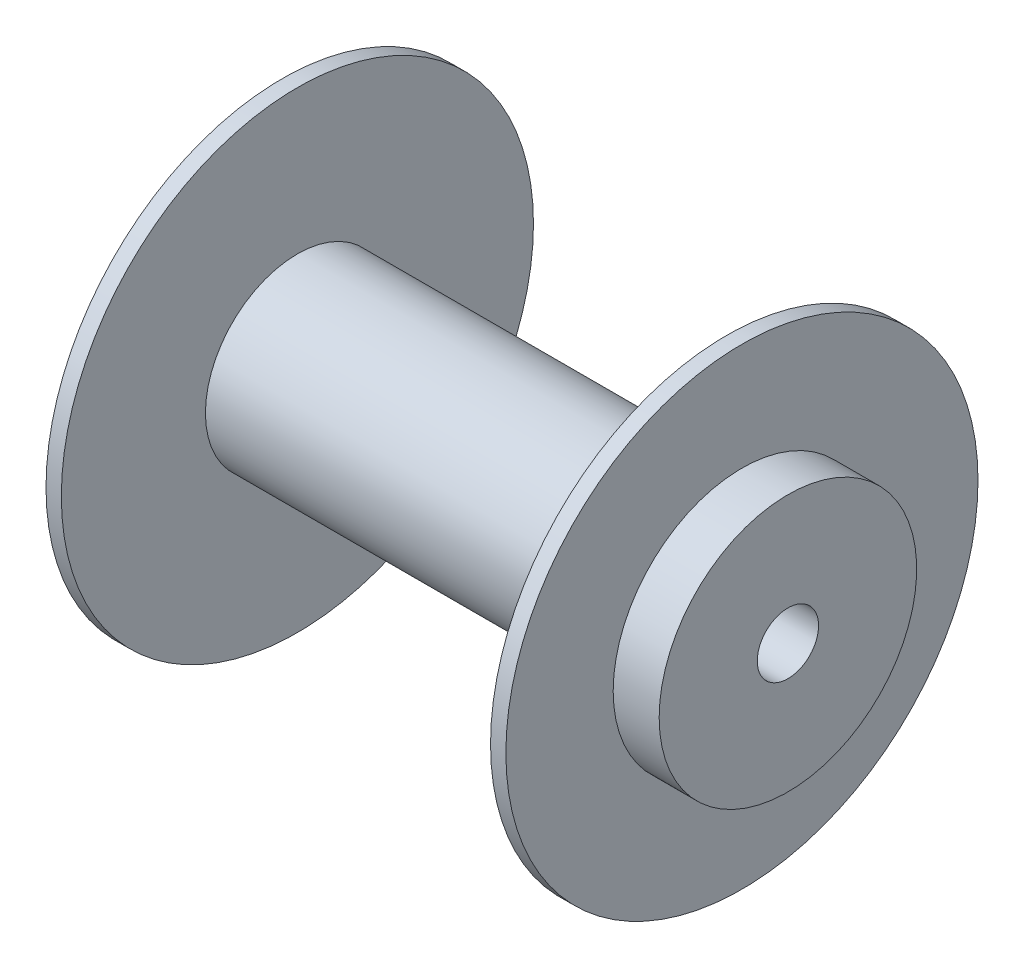
ISO-10303-21;
HEADER;
FILE_DESCRIPTION(('STEP AP214'),'2;1');
FILE_NAME('part.step','',(''),(''),'','','');
FILE_SCHEMA(('AUTOMOTIVE_DESIGN { 1 0 10303 214 1 1 1 1 }'));
ENDSEC;
DATA;
#1=APPLICATION_CONTEXT('core data for automotive mechanical design processes');
#2=APPLICATION_PROTOCOL_DEFINITION('international standard','automotive_design',2000,#1);
#3=PRODUCT_CONTEXT('',#1,'mechanical');
#4=PRODUCT('Part','Part','',(#3));
#5=PRODUCT_RELATED_PRODUCT_CATEGORY('part','',(#4));
#6=PRODUCT_DEFINITION_FORMATION('','',#4);
#7=PRODUCT_DEFINITION_CONTEXT('part definition',#1,'design');
#8=PRODUCT_DEFINITION('design','',#6,#7);
#9=PRODUCT_DEFINITION_SHAPE('','',#8);
#10=(LENGTH_UNIT() NAMED_UNIT(*) SI_UNIT(.MILLI.,.METRE.));
#11=(NAMED_UNIT(*) PLANE_ANGLE_UNIT() SI_UNIT($,.RADIAN.));
#12=(NAMED_UNIT(*) SI_UNIT($,.STERADIAN.) SOLID_ANGLE_UNIT());
#13=UNCERTAINTY_MEASURE_WITH_UNIT(LENGTH_MEASURE(1.E-05),#10,'distance_accuracy_value','');
#14=(GEOMETRIC_REPRESENTATION_CONTEXT(3) GLOBAL_UNCERTAINTY_ASSIGNED_CONTEXT((#13)) GLOBAL_UNIT_ASSIGNED_CONTEXT((#10,
#11,#12)) REPRESENTATION_CONTEXT('',''));
#15=CARTESIAN_POINT('',(0.,0.,0.));
#16=DIRECTION('',(0.,0.,1.));
#17=DIRECTION('',(1.,0.,0.));
#18=AXIS2_PLACEMENT_3D('',#15,#16,#17);
#19=CARTESIAN_POINT('',(160.,0.,0.));
#20=DIRECTION('',(-1.,0.,0.));
#21=DIRECTION('',(0.,0.,1.));
#22=AXIS2_PLACEMENT_3D('',#19,#20,#21);
#23=PLANE('',#22);
#24=CARTESIAN_POINT('',(160.,-30.,0.));
#25=DIRECTION('',(-1.,0.,0.));
#26=DIRECTION('',(0.,0.,1.));
#27=AXIS2_PLACEMENT_3D('',#24,#25,#26);
#28=CIRCLE('',#27,77.);
#29=CARTESIAN_POINT('',(160.,-30.,77.));
#30=VERTEX_POINT('',#29);
#31=EDGE_CURVE('E79',#30,#30,#28,.T.);
#32=ORIENTED_EDGE('',*,*,#31,.T.);
#33=EDGE_LOOP('',(#32));
#34=FACE_BOUND('',#33,.T.);
#35=CARTESIAN_POINT('',(160.,-30.,0.));
#36=DIRECTION('',(-1.,0.,0.));
#37=DIRECTION('',(0.,0.,1.));
#38=AXIS2_PLACEMENT_3D('',#35,#36,#37);
#39=CIRCLE('',#38,30.);
#40=CARTESIAN_POINT('',(160.,-30.,30.));
#41=VERTEX_POINT('',#40);
#42=EDGE_CURVE('E10',#41,#41,#39,.T.);
#43=ORIENTED_EDGE('',*,*,#42,.F.);
#44=EDGE_LOOP('',(#43));
#45=FACE_BOUND('',#44,.T.);
#46=ADVANCED_FACE('F39',(#34,#45),#23,.T.);
#47=CARTESIAN_POINT('',(0.,-30.,0.));
#48=DIRECTION('',(-1.,0.,0.));
#49=DIRECTION('',(0.,0.,1.));
#50=AXIS2_PLACEMENT_3D('',#47,#48,#49);
#51=CYLINDRICAL_SURFACE('',#50,30.);
#52=CARTESIAN_POINT('',(20.,-30.,0.));
#53=DIRECTION('',(-1.,0.,0.));
#54=DIRECTION('',(0.,0.,1.));
#55=AXIS2_PLACEMENT_3D('',#52,#53,#54);
#56=CIRCLE('',#55,30.);
#57=CARTESIAN_POINT('',(20.,-30.,30.));
#58=VERTEX_POINT('',#57);
#59=EDGE_CURVE('E45',#58,#58,#56,.T.);
#60=ORIENTED_EDGE('',*,*,#59,.F.);
#61=EDGE_LOOP('',(#60));
#62=FACE_BOUND('',#61,.T.);
#63=ORIENTED_EDGE('',*,*,#42,.T.);
#64=EDGE_LOOP('',(#63));
#65=FACE_BOUND('',#64,.T.);
#66=ADVANCED_FACE('F97',(#62,#65),#51,.T.);
#67=CARTESIAN_POINT('',(20.,0.,0.));
#68=DIRECTION('',(1.,0.,0.));
#69=DIRECTION('',(0.,0.,-1.));
#70=AXIS2_PLACEMENT_3D('',#67,#68,#69);
#71=PLANE('',#70);
#72=ORIENTED_EDGE('',*,*,#59,.T.);
#73=EDGE_LOOP('',(#72));
#74=FACE_BOUND('',#73,.T.);
#75=CARTESIAN_POINT('',(20.,-30.,0.));
#76=DIRECTION('',(-1.,0.,0.));
#77=DIRECTION('',(0.,0.,1.));
#78=AXIS2_PLACEMENT_3D('',#75,#76,#77);
#79=CIRCLE('',#78,77.);
#80=CARTESIAN_POINT('',(20.,-30.,77.));
#81=VERTEX_POINT('',#80);
#82=EDGE_CURVE('E49',#81,#81,#79,.T.);
#83=ORIENTED_EDGE('',*,*,#82,.F.);
#84=EDGE_LOOP('',(#83));
#85=FACE_BOUND('',#84,.T.);
#86=ADVANCED_FACE('F101',(#74,#85),#71,.T.);
#87=CARTESIAN_POINT('',(0.,-30.,0.));
#88=DIRECTION('',(-1.,0.,0.));
#89=DIRECTION('',(0.,0.,1.));
#90=AXIS2_PLACEMENT_3D('',#87,#88,#89);
#91=CYLINDRICAL_SURFACE('',#90,77.);
#92=ORIENTED_EDGE('',*,*,#82,.T.);
#93=EDGE_LOOP('',(#92));
#94=FACE_BOUND('',#93,.T.);
#95=CARTESIAN_POINT('',(15.,-30.,0.));
#96=DIRECTION('',(-1.,0.,0.));
#97=DIRECTION('',(0.,0.,1.));
#98=AXIS2_PLACEMENT_3D('',#95,#96,#97);
#99=CIRCLE('',#98,77.);
#100=CARTESIAN_POINT('',(15.,-30.,77.));
#101=VERTEX_POINT('',#100);
#102=EDGE_CURVE('E53',#101,#101,#99,.T.);
#103=ORIENTED_EDGE('',*,*,#102,.F.);
#104=EDGE_LOOP('',(#103));
#105=FACE_BOUND('',#104,.T.);
#106=ADVANCED_FACE('F106',(#94,#105),#91,.T.);
#107=CARTESIAN_POINT('',(15.,0.,0.));
#108=DIRECTION('',(-1.,0.,0.));
#109=DIRECTION('',(0.,0.,1.));
#110=AXIS2_PLACEMENT_3D('',#107,#108,#109);
#111=PLANE('',#110);
#112=ORIENTED_EDGE('',*,*,#102,.T.);
#113=EDGE_LOOP('',(#112));
#114=FACE_BOUND('',#113,.T.);
#115=CARTESIAN_POINT('',(15.,-30.,0.));
#116=DIRECTION('',(-1.,0.,0.));
#117=DIRECTION('',(0.,0.,1.));
#118=AXIS2_PLACEMENT_3D('',#115,#116,#117);
#119=CIRCLE('',#118,42.);
#120=CARTESIAN_POINT('',(15.,-30.,42.));
#121=VERTEX_POINT('',#120);
#122=EDGE_CURVE('E58',#121,#121,#119,.T.);
#123=ORIENTED_EDGE('',*,*,#122,.F.);
#124=EDGE_LOOP('',(#123));
#125=FACE_BOUND('',#124,.T.);
#126=ADVANCED_FACE('F111',(#114,#125),#111,.T.);
#127=CARTESIAN_POINT('',(0.,-30.,0.));
#128=DIRECTION('',(-1.,0.,0.));
#129=DIRECTION('',(0.,0.,1.));
#130=AXIS2_PLACEMENT_3D('',#127,#128,#129);
#131=CYLINDRICAL_SURFACE('',#130,42.);
#132=ORIENTED_EDGE('',*,*,#122,.T.);
#133=EDGE_LOOP('',(#132));
#134=FACE_BOUND('',#133,.T.);
#135=CARTESIAN_POINT('',(0.,-30.,0.));
#136=DIRECTION('',(-1.,0.,0.));
#137=DIRECTION('',(0.,0.,1.));
#138=AXIS2_PLACEMENT_3D('',#135,#136,#137);
#139=CIRCLE('',#138,42.);
#140=CARTESIAN_POINT('',(0.,-30.,42.));
#141=VERTEX_POINT('',#140);
#142=EDGE_CURVE('E61',#141,#141,#139,.T.);
#143=ORIENTED_EDGE('',*,*,#142,.F.);
#144=EDGE_LOOP('',(#143));
#145=FACE_BOUND('',#144,.T.);
#146=ADVANCED_FACE('F115',(#134,#145),#131,.T.);
#147=CARTESIAN_POINT('',(0.,0.,0.));
#148=DIRECTION('',(1.,0.,0.));
#149=DIRECTION('',(0.,0.,-1.));
#150=AXIS2_PLACEMENT_3D('',#147,#148,#149);
#151=PLANE('',#150);
#152=CARTESIAN_POINT('',(0.,-30.,0.));
#153=DIRECTION('',(-1.,0.,0.));
#154=DIRECTION('',(0.,0.,1.));
#155=AXIS2_PLACEMENT_3D('',#152,#153,#154);
#156=CIRCLE('',#155,10.);
#157=CARTESIAN_POINT('',(0.,-30.,10.));
#158=VERTEX_POINT('',#157);
#159=EDGE_CURVE('E64',#158,#158,#156,.T.);
#160=ORIENTED_EDGE('',*,*,#159,.F.);
#161=EDGE_LOOP('',(#160));
#162=FACE_BOUND('',#161,.T.);
#163=ORIENTED_EDGE('',*,*,#142,.T.);
#164=EDGE_LOOP('',(#163));
#165=FACE_BOUND('',#164,.T.);
#166=ADVANCED_FACE('F119',(#162,#165),#151,.F.);
#167=CARTESIAN_POINT('',(0.,-30.,0.));
#168=DIRECTION('',(-1.,0.,0.));
#169=DIRECTION('',(0.,0.,1.));
#170=AXIS2_PLACEMENT_3D('',#167,#168,#169);
#171=CYLINDRICAL_SURFACE('',#170,10.);
#172=CARTESIAN_POINT('',(180.,-30.,0.));
#173=DIRECTION('',(-1.,0.,0.));
#174=DIRECTION('',(0.,0.,1.));
#175=AXIS2_PLACEMENT_3D('',#172,#173,#174);
#176=CIRCLE('',#175,10.);
#177=CARTESIAN_POINT('',(180.,-30.,10.));
#178=VERTEX_POINT('',#177);
#179=EDGE_CURVE('E67',#178,#178,#176,.T.);
#180=ORIENTED_EDGE('',*,*,#179,.F.);
#181=EDGE_LOOP('',(#180));
#182=FACE_BOUND('',#181,.T.);
#183=ORIENTED_EDGE('',*,*,#159,.T.);
#184=EDGE_LOOP('',(#183));
#185=FACE_BOUND('',#184,.T.);
#186=ADVANCED_FACE('F123',(#182,#185),#171,.F.);
#187=CARTESIAN_POINT('',(180.,0.,0.));
#188=DIRECTION('',(1.,0.,0.));
#189=DIRECTION('',(0.,0.,-1.));
#190=AXIS2_PLACEMENT_3D('',#187,#188,#189);
#191=PLANE('',#190);
#192=ORIENTED_EDGE('',*,*,#179,.T.);
#193=EDGE_LOOP('',(#192));
#194=FACE_BOUND('',#193,.T.);
#195=CARTESIAN_POINT('',(180.,-30.,0.));
#196=DIRECTION('',(-1.,0.,0.));
#197=DIRECTION('',(0.,0.,1.));
#198=AXIS2_PLACEMENT_3D('',#195,#196,#197);
#199=CIRCLE('',#198,42.);
#200=CARTESIAN_POINT('',(180.,-30.,42.));
#201=VERTEX_POINT('',#200);
#202=EDGE_CURVE('E70',#201,#201,#199,.T.);
#203=ORIENTED_EDGE('',*,*,#202,.F.);
#204=EDGE_LOOP('',(#203));
#205=FACE_BOUND('',#204,.T.);
#206=ADVANCED_FACE('F127',(#194,#205),#191,.T.);
#207=CARTESIAN_POINT('',(0.,-30.,0.));
#208=DIRECTION('',(-1.,0.,0.));
#209=DIRECTION('',(0.,0.,1.));
#210=AXIS2_PLACEMENT_3D('',#207,#208,#209);
#211=CYLINDRICAL_SURFACE('',#210,42.);
#212=ORIENTED_EDGE('',*,*,#202,.T.);
#213=EDGE_LOOP('',(#212));
#214=FACE_BOUND('',#213,.T.);
#215=CARTESIAN_POINT('',(165.,-30.,0.));
#216=DIRECTION('',(-1.,0.,0.));
#217=DIRECTION('',(0.,0.,1.));
#218=AXIS2_PLACEMENT_3D('',#215,#216,#217);
#219=CIRCLE('',#218,42.);
#220=CARTESIAN_POINT('',(165.,-30.,42.));
#221=VERTEX_POINT('',#220);
#222=EDGE_CURVE('E73',#221,#221,#219,.T.);
#223=ORIENTED_EDGE('',*,*,#222,.F.);
#224=EDGE_LOOP('',(#223));
#225=FACE_BOUND('',#224,.T.);
#226=ADVANCED_FACE('F93',(#214,#225),#211,.T.);
#227=CARTESIAN_POINT('',(165.,0.,0.));
#228=DIRECTION('',(1.,0.,0.));
#229=DIRECTION('',(0.,0.,-1.));
#230=AXIS2_PLACEMENT_3D('',#227,#228,#229);
#231=PLANE('',#230);
#232=ORIENTED_EDGE('',*,*,#222,.T.);
#233=EDGE_LOOP('',(#232));
#234=FACE_BOUND('',#233,.T.);
#235=CARTESIAN_POINT('',(165.,-30.,0.));
#236=DIRECTION('',(-1.,0.,0.));
#237=DIRECTION('',(0.,0.,1.));
#238=AXIS2_PLACEMENT_3D('',#235,#236,#237);
#239=CIRCLE('',#238,77.);
#240=CARTESIAN_POINT('',(165.,-30.,77.));
#241=VERTEX_POINT('',#240);
#242=EDGE_CURVE('E76',#241,#241,#239,.T.);
#243=ORIENTED_EDGE('',*,*,#242,.F.);
#244=EDGE_LOOP('',(#243));
#245=FACE_BOUND('',#244,.T.);
#246=ADVANCED_FACE('F87',(#234,#245),#231,.T.);
#247=CARTESIAN_POINT('',(0.,-30.,0.));
#248=DIRECTION('',(-1.,0.,0.));
#249=DIRECTION('',(0.,0.,1.));
#250=AXIS2_PLACEMENT_3D('',#247,#248,#249);
#251=CYLINDRICAL_SURFACE('',#250,77.);
#252=ORIENTED_EDGE('',*,*,#242,.T.);
#253=EDGE_LOOP('',(#252));
#254=FACE_BOUND('',#253,.T.);
#255=ORIENTED_EDGE('',*,*,#31,.F.);
#256=EDGE_LOOP('',(#255));
#257=FACE_BOUND('',#256,.T.);
#258=ADVANCED_FACE('F85',(#254,#257),#251,.T.);
#259=CLOSED_SHELL('',(#46,#66,#86,#106,#126,#146,#166,#186,#206,#226,#246,#258));
#260=MANIFOLD_SOLID_BREP('B2',#259);
#261=ADVANCED_BREP_SHAPE_REPRESENTATION('',(#18,#260),#14);
#262=SHAPE_DEFINITION_REPRESENTATION(#9,#261);
ENDSEC;
END-ISO-10303-21;
